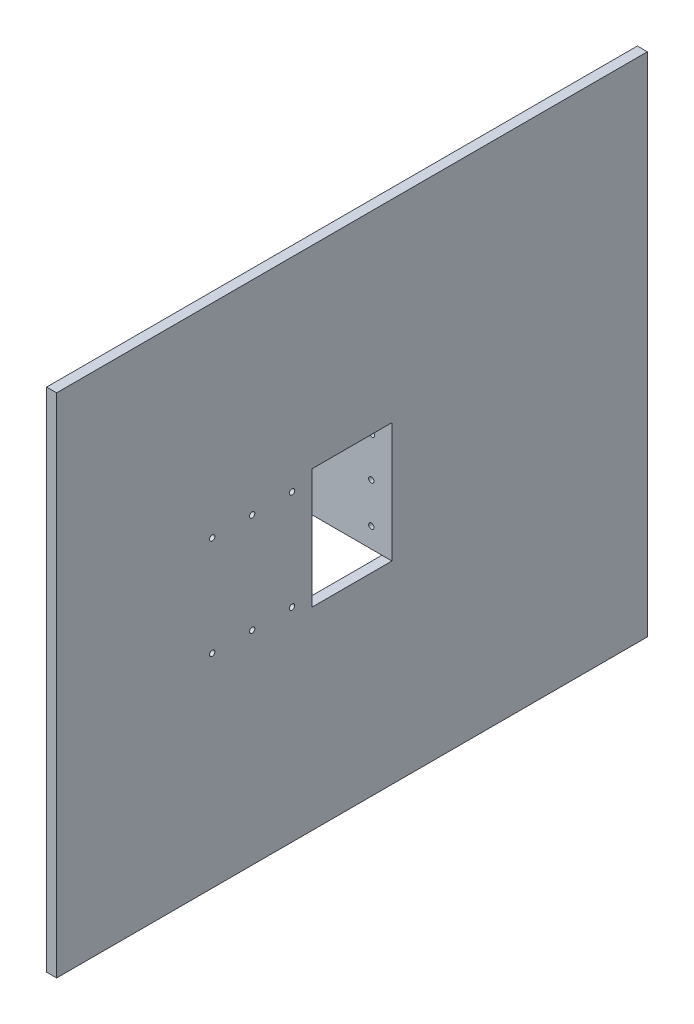
ISO-10303-21;
HEADER;
FILE_DESCRIPTION(('STEP AP214'),'2;1');
FILE_NAME('part.step','',(''),(''),'','','');
FILE_SCHEMA(('AUTOMOTIVE_DESIGN { 1 0 10303 214 1 1 1 1 }'));
ENDSEC;
DATA;
#1=APPLICATION_CONTEXT('core data for automotive mechanical design processes');
#2=APPLICATION_PROTOCOL_DEFINITION('international standard','automotive_design',2000,#1);
#3=PRODUCT_CONTEXT('',#1,'mechanical');
#4=PRODUCT('Part','Part','',(#3));
#5=PRODUCT_RELATED_PRODUCT_CATEGORY('part','',(#4));
#6=PRODUCT_DEFINITION_FORMATION('','',#4);
#7=PRODUCT_DEFINITION_CONTEXT('part definition',#1,'design');
#8=PRODUCT_DEFINITION('design','',#6,#7);
#9=PRODUCT_DEFINITION_SHAPE('','',#8);
#10=(LENGTH_UNIT() NAMED_UNIT(*) SI_UNIT(.MILLI.,.METRE.));
#11=(NAMED_UNIT(*) PLANE_ANGLE_UNIT() SI_UNIT($,.RADIAN.));
#12=(NAMED_UNIT(*) SI_UNIT($,.STERADIAN.) SOLID_ANGLE_UNIT());
#13=UNCERTAINTY_MEASURE_WITH_UNIT(LENGTH_MEASURE(1.E-05),#10,'distance_accuracy_value','');
#14=(GEOMETRIC_REPRESENTATION_CONTEXT(3) GLOBAL_UNCERTAINTY_ASSIGNED_CONTEXT((#13)) GLOBAL_UNIT_ASSIGNED_CONTEXT((#10,
#11,#12)) REPRESENTATION_CONTEXT('',''));
#15=CARTESIAN_POINT('',(0.,0.,0.));
#16=DIRECTION('',(0.,0.,1.));
#17=DIRECTION('',(1.,0.,0.));
#18=AXIS2_PLACEMENT_3D('',#15,#16,#17);
#19=CARTESIAN_POINT('',(0.,0.,15.));
#20=DIRECTION('',(0.,0.,-1.));
#21=DIRECTION('',(-1.,0.,0.));
#22=AXIS2_PLACEMENT_3D('',#19,#20,#21);
#23=PLANE('',#22);
#24=CARTESIAN_POINT('',(74.0356255045645,0.,15.));
#25=DIRECTION('',(0.,0.,1.));
#26=DIRECTION('',(-1.,0.,0.));
#27=AXIS2_PLACEMENT_3D('',#24,#25,#26);
#28=CIRCLE('',#27,4.00000000000001);
#29=CARTESIAN_POINT('',(70.0356255045645,0.,15.));
#30=VERTEX_POINT('',#29);
#31=EDGE_CURVE('E204',#30,#30,#28,.T.);
#32=ORIENTED_EDGE('',*,*,#31,.F.);
#33=EDGE_LOOP('',(#32));
#34=FACE_BOUND('',#33,.T.);
#35=CARTESIAN_POINT('',(-74.0356255045645,-60.,15.));
#36=DIRECTION('',(0.,0.,1.));
#37=DIRECTION('',(1.,0.,0.));
#38=AXIS2_PLACEMENT_3D('',#35,#36,#37);
#39=CIRCLE('',#38,4.00000000000001);
#40=CARTESIAN_POINT('',(-70.0356255045645,-60.,15.));
#41=VERTEX_POINT('',#40);
#42=EDGE_CURVE('E216',#41,#41,#39,.T.);
#43=ORIENTED_EDGE('',*,*,#42,.F.);
#44=EDGE_LOOP('',(#43));
#45=FACE_BOUND('',#44,.T.);
#46=CARTESIAN_POINT('',(-75.,60.,15.));
#47=DIRECTION('',(0.,0.,1.));
#48=DIRECTION('',(1.,0.,0.));
#49=AXIS2_PLACEMENT_3D('',#46,#47,#48);
#50=CIRCLE('',#49,4.00000000000001);
#51=CARTESIAN_POINT('',(-71.,60.,15.));
#52=VERTEX_POINT('',#51);
#53=EDGE_CURVE('E228',#52,#52,#50,.T.);
#54=ORIENTED_EDGE('',*,*,#53,.F.);
#55=EDGE_LOOP('',(#54));
#56=FACE_BOUND('',#55,.T.);
#57=DIRECTION('',(1.,0.,0.));
#58=VECTOR('',#57,1.);
#59=CARTESIAN_POINT('',(-90.,-90.,15.));
#60=LINE('',#59,#58);
#61=CARTESIAN_POINT('',(-90.,-90.,15.));
#62=VERTEX_POINT('',#61);
#63=CARTESIAN_POINT('',(90.,-90.,15.));
#64=VERTEX_POINT('',#63);
#65=EDGE_CURVE('E52',#62,#64,#60,.T.);
#66=ORIENTED_EDGE('',*,*,#65,.T.);
#67=DIRECTION('',(-1.,0.,0.));
#68=VECTOR('',#67,1.);
#69=CARTESIAN_POINT('',(105.,-90.,15.));
#70=LINE('',#69,#68);
#71=CARTESIAN_POINT('',(105.,-90.,15.));
#72=VERTEX_POINT('',#71);
#73=EDGE_CURVE('E130',#72,#64,#70,.T.);
#74=ORIENTED_EDGE('',*,*,#73,.F.);
#75=DIRECTION('',(0.,1.,0.));
#76=VECTOR('',#75,1.);
#77=CARTESIAN_POINT('',(105.,-90.,15.));
#78=LINE('',#77,#76);
#79=CARTESIAN_POINT('',(105.,90.,15.));
#80=VERTEX_POINT('',#79);
#81=EDGE_CURVE('E125',#72,#80,#78,.T.);
#82=ORIENTED_EDGE('',*,*,#81,.T.);
#83=DIRECTION('',(-1.,0.,0.));
#84=VECTOR('',#83,1.);
#85=CARTESIAN_POINT('',(105.,90.,15.));
#86=LINE('',#85,#84);
#87=CARTESIAN_POINT('',(90.,90.,15.));
#88=VERTEX_POINT('',#87);
#89=EDGE_CURVE('E128',#80,#88,#86,.T.);
#90=ORIENTED_EDGE('',*,*,#89,.T.);
#91=DIRECTION('',(-1.,0.,0.));
#92=VECTOR('',#91,1.);
#93=CARTESIAN_POINT('',(-90.,90.,15.));
#94=LINE('',#93,#92);
#95=CARTESIAN_POINT('',(-90.,90.,15.));
#96=VERTEX_POINT('',#95);
#97=EDGE_CURVE('E77',#88,#96,#94,.T.);
#98=ORIENTED_EDGE('',*,*,#97,.T.);
#99=DIRECTION('',(0.,-1.,0.));
#100=VECTOR('',#99,1.);
#101=CARTESIAN_POINT('',(-90.,-90.,15.));
#102=LINE('',#101,#100);
#103=EDGE_CURVE('E235',#96,#62,#102,.T.);
#104=ORIENTED_EDGE('',*,*,#103,.T.);
#105=EDGE_LOOP('',(#66,#74,#82,#90,#98,#104));
#106=FACE_BOUND('',#105,.T.);
#107=CARTESIAN_POINT('',(-74.0356255045645,0.,15.));
#108=DIRECTION('',(0.,0.,1.));
#109=DIRECTION('',(1.,0.,0.));
#110=AXIS2_PLACEMENT_3D('',#107,#108,#109);
#111=CIRCLE('',#110,4.00000000000001);
#112=CARTESIAN_POINT('',(-70.0356255045645,0.,15.));
#113=VERTEX_POINT('',#112);
#114=EDGE_CURVE('E222',#113,#113,#111,.T.);
#115=ORIENTED_EDGE('',*,*,#114,.F.);
#116=EDGE_LOOP('',(#115));
#117=FACE_BOUND('',#116,.T.);
#118=CARTESIAN_POINT('',(74.0356255045645,-60.,15.));
#119=DIRECTION('',(0.,0.,1.));
#120=DIRECTION('',(-1.,0.,0.));
#121=AXIS2_PLACEMENT_3D('',#118,#119,#120);
#122=CIRCLE('',#121,4.00000000000001);
#123=CARTESIAN_POINT('',(70.0356255045645,-60.,15.));
#124=VERTEX_POINT('',#123);
#125=EDGE_CURVE('E210',#124,#124,#122,.T.);
#126=ORIENTED_EDGE('',*,*,#125,.F.);
#127=EDGE_LOOP('',(#126));
#128=FACE_BOUND('',#127,.T.);
#129=CARTESIAN_POINT('',(75.,60.,15.));
#130=DIRECTION('',(0.,0.,1.));
#131=DIRECTION('',(-1.,0.,0.));
#132=AXIS2_PLACEMENT_3D('',#129,#130,#131);
#133=CIRCLE('',#132,4.00000000000001);
#134=CARTESIAN_POINT('',(71.,60.,15.));
#135=VERTEX_POINT('',#134);
#136=EDGE_CURVE('E198',#135,#135,#133,.T.);
#137=ORIENTED_EDGE('',*,*,#136,.F.);
#138=EDGE_LOOP('',(#137));
#139=FACE_BOUND('',#138,.T.);
#140=ADVANCED_FACE('F35',(#34,#45,#56,#106,#117,#128,#139),#23,.F.);
#141=CARTESIAN_POINT('',(0.,0.,0.));
#142=DIRECTION('',(0.,0.,-1.));
#143=DIRECTION('',(-1.,0.,0.));
#144=AXIS2_PLACEMENT_3D('',#141,#142,#143);
#145=PLANE('',#144);
#146=CARTESIAN_POINT('',(74.0356255045645,0.,0.));
#147=DIRECTION('',(0.,0.,1.));
#148=DIRECTION('',(-1.,0.,0.));
#149=AXIS2_PLACEMENT_3D('',#146,#147,#148);
#150=CIRCLE('',#149,4.00000000000001);
#151=CARTESIAN_POINT('',(70.0356255045645,0.,0.));
#152=VERTEX_POINT('',#151);
#153=EDGE_CURVE('E201',#152,#152,#150,.T.);
#154=ORIENTED_EDGE('',*,*,#153,.T.);
#155=EDGE_LOOP('',(#154));
#156=FACE_BOUND('',#155,.T.);
#157=CARTESIAN_POINT('',(-74.0356255045645,-60.,0.));
#158=DIRECTION('',(0.,0.,1.));
#159=DIRECTION('',(1.,0.,0.));
#160=AXIS2_PLACEMENT_3D('',#157,#158,#159);
#161=CIRCLE('',#160,4.00000000000001);
#162=CARTESIAN_POINT('',(-70.0356255045645,-60.,0.));
#163=VERTEX_POINT('',#162);
#164=EDGE_CURVE('E213',#163,#163,#161,.T.);
#165=ORIENTED_EDGE('',*,*,#164,.T.);
#166=EDGE_LOOP('',(#165));
#167=FACE_BOUND('',#166,.T.);
#168=CARTESIAN_POINT('',(-75.,60.,0.));
#169=DIRECTION('',(0.,0.,1.));
#170=DIRECTION('',(1.,0.,0.));
#171=AXIS2_PLACEMENT_3D('',#168,#169,#170);
#172=CIRCLE('',#171,4.00000000000001);
#173=CARTESIAN_POINT('',(-71.,60.,0.));
#174=VERTEX_POINT('',#173);
#175=EDGE_CURVE('E225',#174,#174,#172,.T.);
#176=ORIENTED_EDGE('',*,*,#175,.T.);
#177=EDGE_LOOP('',(#176));
#178=FACE_BOUND('',#177,.T.);
#179=DIRECTION('',(0.,1.,0.));
#180=VECTOR('',#179,1.);
#181=CARTESIAN_POINT('',(90.,-90.,0.));
#182=LINE('',#181,#180);
#183=CARTESIAN_POINT('',(90.,-90.,0.));
#184=VERTEX_POINT('',#183);
#185=CARTESIAN_POINT('',(90.,90.,0.));
#186=VERTEX_POINT('',#185);
#187=EDGE_CURVE('E231',#184,#186,#182,.T.);
#188=ORIENTED_EDGE('',*,*,#187,.F.);
#189=DIRECTION('',(1.,0.,0.));
#190=VECTOR('',#189,1.);
#191=CARTESIAN_POINT('',(-90.,-90.,0.));
#192=LINE('',#191,#190);
#193=CARTESIAN_POINT('',(-90.,-90.,0.));
#194=VERTEX_POINT('',#193);
#195=EDGE_CURVE('E236',#194,#184,#192,.T.);
#196=ORIENTED_EDGE('',*,*,#195,.F.);
#197=DIRECTION('',(0.,-1.,0.));
#198=VECTOR('',#197,1.);
#199=CARTESIAN_POINT('',(-90.,-90.,0.));
#200=LINE('',#199,#198);
#201=CARTESIAN_POINT('',(-90.,90.,0.));
#202=VERTEX_POINT('',#201);
#203=EDGE_CURVE('E72',#202,#194,#200,.T.);
#204=ORIENTED_EDGE('',*,*,#203,.F.);
#205=DIRECTION('',(-1.,0.,0.));
#206=VECTOR('',#205,1.);
#207=CARTESIAN_POINT('',(-90.,90.,0.));
#208=LINE('',#207,#206);
#209=EDGE_CURVE('E65',#186,#202,#208,.T.);
#210=ORIENTED_EDGE('',*,*,#209,.F.);
#211=EDGE_LOOP('',(#188,#196,#204,#210));
#212=FACE_BOUND('',#211,.T.);
#213=CARTESIAN_POINT('',(-74.0356255045645,0.,0.));
#214=DIRECTION('',(0.,0.,1.));
#215=DIRECTION('',(1.,0.,0.));
#216=AXIS2_PLACEMENT_3D('',#213,#214,#215);
#217=CIRCLE('',#216,4.00000000000001);
#218=CARTESIAN_POINT('',(-70.0356255045645,0.,0.));
#219=VERTEX_POINT('',#218);
#220=EDGE_CURVE('E219',#219,#219,#217,.T.);
#221=ORIENTED_EDGE('',*,*,#220,.T.);
#222=EDGE_LOOP('',(#221));
#223=FACE_BOUND('',#222,.T.);
#224=CARTESIAN_POINT('',(74.0356255045645,-60.,0.));
#225=DIRECTION('',(0.,0.,1.));
#226=DIRECTION('',(-1.,0.,0.));
#227=AXIS2_PLACEMENT_3D('',#224,#225,#226);
#228=CIRCLE('',#227,4.00000000000001);
#229=CARTESIAN_POINT('',(70.0356255045645,-60.,0.));
#230=VERTEX_POINT('',#229);
#231=EDGE_CURVE('E207',#230,#230,#228,.T.);
#232=ORIENTED_EDGE('',*,*,#231,.T.);
#233=EDGE_LOOP('',(#232));
#234=FACE_BOUND('',#233,.T.);
#235=CARTESIAN_POINT('',(75.,60.,0.));
#236=DIRECTION('',(0.,0.,1.));
#237=DIRECTION('',(-1.,0.,0.));
#238=AXIS2_PLACEMENT_3D('',#235,#236,#237);
#239=CIRCLE('',#238,4.00000000000001);
#240=CARTESIAN_POINT('',(71.,60.,0.));
#241=VERTEX_POINT('',#240);
#242=EDGE_CURVE('E197',#241,#241,#239,.T.);
#243=ORIENTED_EDGE('',*,*,#242,.T.);
#244=EDGE_LOOP('',(#243));
#245=FACE_BOUND('',#244,.T.);
#246=ADVANCED_FACE('F253',(#156,#167,#178,#212,#223,#234,#245),#145,.T.);
#247=CARTESIAN_POINT('',(-90.,90.,15.));
#248=DIRECTION('',(0.,-1.,0.));
#249=DIRECTION('',(0.,0.,-1.));
#250=AXIS2_PLACEMENT_3D('',#247,#248,#249);
#251=PLANE('',#250);
#252=ORIENTED_EDGE('',*,*,#209,.T.);
#253=DIRECTION('',(0.,0.,-1.));
#254=VECTOR('',#253,1.);
#255=CARTESIAN_POINT('',(-90.,90.,15.));
#256=LINE('',#255,#254);
#257=EDGE_CURVE('E44',#96,#202,#256,.T.);
#258=ORIENTED_EDGE('',*,*,#257,.F.);
#259=ORIENTED_EDGE('',*,*,#97,.F.);
#260=DIRECTION('',(0.,0.,-1.));
#261=VECTOR('',#260,1.);
#262=CARTESIAN_POINT('',(90.,90.,15.));
#263=LINE('',#262,#261);
#264=EDGE_CURVE('E11',#88,#186,#263,.T.);
#265=ORIENTED_EDGE('',*,*,#264,.T.);
#266=EDGE_LOOP('',(#252,#258,#259,#265));
#267=FACE_BOUND('',#266,.T.);
#268=ADVANCED_FACE('F37',(#267),#251,.F.);
#269=CARTESIAN_POINT('',(-90.,-90.,15.));
#270=DIRECTION('',(1.,0.,0.));
#271=DIRECTION('',(0.,0.,-1.));
#272=AXIS2_PLACEMENT_3D('',#269,#270,#271);
#273=PLANE('',#272);
#274=ORIENTED_EDGE('',*,*,#203,.T.);
#275=DIRECTION('',(0.,0.,-1.));
#276=VECTOR('',#275,1.);
#277=CARTESIAN_POINT('',(-90.,-90.,15.));
#278=LINE('',#277,#276);
#279=EDGE_CURVE('E248',#62,#194,#278,.T.);
#280=ORIENTED_EDGE('',*,*,#279,.F.);
#281=ORIENTED_EDGE('',*,*,#103,.F.);
#282=ORIENTED_EDGE('',*,*,#257,.T.);
#283=EDGE_LOOP('',(#274,#280,#281,#282));
#284=FACE_BOUND('',#283,.T.);
#285=ADVANCED_FACE('F250',(#284),#273,.F.);
#286=CARTESIAN_POINT('',(-90.,-90.,15.));
#287=DIRECTION('',(0.,1.,0.));
#288=DIRECTION('',(0.,0.,1.));
#289=AXIS2_PLACEMENT_3D('',#286,#287,#288);
#290=PLANE('',#289);
#291=ORIENTED_EDGE('',*,*,#195,.T.);
#292=DIRECTION('',(0.,0.,-1.));
#293=VECTOR('',#292,1.);
#294=CARTESIAN_POINT('',(90.,-90.,15.));
#295=LINE('',#294,#293);
#296=EDGE_CURVE('E239',#64,#184,#295,.T.);
#297=ORIENTED_EDGE('',*,*,#296,.F.);
#298=ORIENTED_EDGE('',*,*,#65,.F.);
#299=ORIENTED_EDGE('',*,*,#279,.T.);
#300=EDGE_LOOP('',(#291,#297,#298,#299));
#301=FACE_BOUND('',#300,.T.);
#302=ADVANCED_FACE('F256',(#301),#290,.F.);
#303=CARTESIAN_POINT('',(-75.,60.,15.));
#304=DIRECTION('',(0.,0.,-1.));
#305=DIRECTION('',(-1.,0.,0.));
#306=AXIS2_PLACEMENT_3D('',#303,#304,#305);
#307=CYLINDRICAL_SURFACE('',#306,4.00000000000001);
#308=ORIENTED_EDGE('',*,*,#53,.T.);
#309=EDGE_LOOP('',(#308));
#310=FACE_BOUND('',#309,.T.);
#311=ORIENTED_EDGE('',*,*,#175,.F.);
#312=EDGE_LOOP('',(#311));
#313=FACE_BOUND('',#312,.T.);
#314=ADVANCED_FACE('F280',(#310,#313),#307,.F.);
#315=CARTESIAN_POINT('',(-74.0356255045645,0.,15.));
#316=DIRECTION('',(0.,0.,-1.));
#317=DIRECTION('',(-1.,0.,0.));
#318=AXIS2_PLACEMENT_3D('',#315,#316,#317);
#319=CYLINDRICAL_SURFACE('',#318,4.00000000000001);
#320=ORIENTED_EDGE('',*,*,#114,.T.);
#321=EDGE_LOOP('',(#320));
#322=FACE_BOUND('',#321,.T.);
#323=ORIENTED_EDGE('',*,*,#220,.F.);
#324=EDGE_LOOP('',(#323));
#325=FACE_BOUND('',#324,.T.);
#326=ADVANCED_FACE('F287',(#322,#325),#319,.F.);
#327=CARTESIAN_POINT('',(-74.0356255045645,-60.,15.));
#328=DIRECTION('',(0.,0.,-1.));
#329=DIRECTION('',(-1.,0.,0.));
#330=AXIS2_PLACEMENT_3D('',#327,#328,#329);
#331=CYLINDRICAL_SURFACE('',#330,4.00000000000001);
#332=ORIENTED_EDGE('',*,*,#42,.T.);
#333=EDGE_LOOP('',(#332));
#334=FACE_BOUND('',#333,.T.);
#335=ORIENTED_EDGE('',*,*,#164,.F.);
#336=EDGE_LOOP('',(#335));
#337=FACE_BOUND('',#336,.T.);
#338=ADVANCED_FACE('F292',(#334,#337),#331,.F.);
#339=CARTESIAN_POINT('',(74.0356255045645,-60.,15.));
#340=DIRECTION('',(0.,0.,-1.));
#341=DIRECTION('',(-1.,0.,0.));
#342=AXIS2_PLACEMENT_3D('',#339,#340,#341);
#343=CYLINDRICAL_SURFACE('',#342,4.00000000000001);
#344=ORIENTED_EDGE('',*,*,#125,.T.);
#345=EDGE_LOOP('',(#344));
#346=FACE_BOUND('',#345,.T.);
#347=ORIENTED_EDGE('',*,*,#231,.F.);
#348=EDGE_LOOP('',(#347));
#349=FACE_BOUND('',#348,.T.);
#350=ADVANCED_FACE('F302',(#346,#349),#343,.F.);
#351=CARTESIAN_POINT('',(74.0356255045645,0.,15.));
#352=DIRECTION('',(0.,0.,-1.));
#353=DIRECTION('',(-1.,0.,0.));
#354=AXIS2_PLACEMENT_3D('',#351,#352,#353);
#355=CYLINDRICAL_SURFACE('',#354,4.00000000000001);
#356=ORIENTED_EDGE('',*,*,#31,.T.);
#357=EDGE_LOOP('',(#356));
#358=FACE_BOUND('',#357,.T.);
#359=ORIENTED_EDGE('',*,*,#153,.F.);
#360=EDGE_LOOP('',(#359));
#361=FACE_BOUND('',#360,.T.);
#362=ADVANCED_FACE('F309',(#358,#361),#355,.F.);
#363=CARTESIAN_POINT('',(75.,60.,15.));
#364=DIRECTION('',(0.,0.,-1.));
#365=DIRECTION('',(-1.,0.,0.));
#366=AXIS2_PLACEMENT_3D('',#363,#364,#365);
#367=CYLINDRICAL_SURFACE('',#366,4.00000000000001);
#368=ORIENTED_EDGE('',*,*,#136,.T.);
#369=EDGE_LOOP('',(#368));
#370=FACE_BOUND('',#369,.T.);
#371=ORIENTED_EDGE('',*,*,#242,.F.);
#372=EDGE_LOOP('',(#371));
#373=FACE_BOUND('',#372,.T.);
#374=ADVANCED_FACE('F313',(#370,#373),#367,.F.);
#375=CARTESIAN_POINT('',(90.,0.,0.));
#376=DIRECTION('',(-1.,0.,0.));
#377=DIRECTION('',(0.,0.,1.));
#378=AXIS2_PLACEMENT_3D('',#375,#376,#377);
#379=PLANE('',#378);
#380=CARTESIAN_POINT('',(90.,-75.,165.));
#381=DIRECTION('',(1.,0.,0.));
#382=DIRECTION('',(0.,0.,1.));
#383=AXIS2_PLACEMENT_3D('',#380,#381,#382);
#384=CIRCLE('',#383,3.99999999999999);
#385=CARTESIAN_POINT('',(90.,-75.,169.));
#386=VERTEX_POINT('',#385);
#387=EDGE_CURVE('E377',#386,#386,#384,.T.);
#388=ORIENTED_EDGE('',*,*,#387,.T.);
#389=EDGE_LOOP('',(#388));
#390=FACE_BOUND('',#389,.T.);
#391=CARTESIAN_POINT('',(90.,75.,285.));
#392=DIRECTION('',(1.,0.,0.));
#393=DIRECTION('',(0.,0.,-1.));
#394=AXIS2_PLACEMENT_3D('',#391,#392,#393);
#395=CIRCLE('',#394,3.99999999999999);
#396=CARTESIAN_POINT('',(90.,75.,281.));
#397=VERTEX_POINT('',#396);
#398=EDGE_CURVE('E385',#397,#397,#395,.T.);
#399=ORIENTED_EDGE('',*,*,#398,.T.);
#400=EDGE_LOOP('',(#399));
#401=FACE_BOUND('',#400,.T.);
#402=CARTESIAN_POINT('',(90.,75.,225.));
#403=DIRECTION('',(1.,0.,0.));
#404=DIRECTION('',(0.,0.,-1.));
#405=AXIS2_PLACEMENT_3D('',#402,#403,#404);
#406=CIRCLE('',#405,3.99999999999999);
#407=CARTESIAN_POINT('',(90.,75.,221.));
#408=VERTEX_POINT('',#407);
#409=EDGE_CURVE('E397',#408,#408,#406,.T.);
#410=ORIENTED_EDGE('',*,*,#409,.T.);
#411=EDGE_LOOP('',(#410));
#412=FACE_BOUND('',#411,.T.);
#413=DIRECTION('',(0.,1.,0.));
#414=VECTOR('',#413,1.);
#415=CARTESIAN_POINT('',(90.,-380.716091082517,-368.779119663687));
#416=LINE('',#415,#414);
#417=CARTESIAN_POINT('',(90.,-380.716091082517,-368.779119663687));
#418=VERTEX_POINT('',#417);
#419=CARTESIAN_POINT('',(90.,380.716091082517,-368.779119663687));
#420=VERTEX_POINT('',#419);
#421=EDGE_CURVE('E143',#418,#420,#416,.T.);
#422=ORIENTED_EDGE('',*,*,#421,.F.);
#423=DIRECTION('',(0.,0.,-1.));
#424=VECTOR('',#423,1.);
#425=CARTESIAN_POINT('',(90.,-380.716091082517,518.779119663687));
#426=LINE('',#425,#424);
#427=CARTESIAN_POINT('',(90.,-380.716091082517,518.779119663687));
#428=VERTEX_POINT('',#427);
#429=EDGE_CURVE('E172',#428,#418,#426,.T.);
#430=ORIENTED_EDGE('',*,*,#429,.F.);
#431=DIRECTION('',(0.,-1.,0.));
#432=VECTOR('',#431,1.);
#433=CARTESIAN_POINT('',(90.,-380.716091082517,518.779119663687));
#434=LINE('',#433,#432);
#435=CARTESIAN_POINT('',(90.,380.716091082517,518.779119663687));
#436=VERTEX_POINT('',#435);
#437=EDGE_CURVE('E183',#436,#428,#434,.T.);
#438=ORIENTED_EDGE('',*,*,#437,.F.);
#439=DIRECTION('',(0.,0.,1.));
#440=VECTOR('',#439,1.);
#441=CARTESIAN_POINT('',(90.,380.716091082517,518.779119663687));
#442=LINE('',#441,#440);
#443=EDGE_CURVE('E181',#420,#436,#442,.T.);
#444=ORIENTED_EDGE('',*,*,#443,.F.);
#445=EDGE_LOOP('',(#422,#430,#438,#444));
#446=FACE_BOUND('',#445,.T.);
#447=CARTESIAN_POINT('',(90.,75.,165.));
#448=DIRECTION('',(1.,0.,0.));
#449=DIRECTION('',(0.,0.,-1.));
#450=AXIS2_PLACEMENT_3D('',#447,#448,#449);
#451=CIRCLE('',#450,3.99999999999999);
#452=CARTESIAN_POINT('',(90.,75.,161.));
#453=VERTEX_POINT('',#452);
#454=EDGE_CURVE('E403',#453,#453,#451,.T.);
#455=ORIENTED_EDGE('',*,*,#454,.T.);
#456=EDGE_LOOP('',(#455));
#457=FACE_BOUND('',#456,.T.);
#458=CARTESIAN_POINT('',(90.,-75.,285.));
#459=DIRECTION('',(1.,0.,0.));
#460=DIRECTION('',(0.,0.,1.));
#461=AXIS2_PLACEMENT_3D('',#458,#459,#460);
#462=CIRCLE('',#461,3.99999999999999);
#463=CARTESIAN_POINT('',(90.,-75.,289.));
#464=VERTEX_POINT('',#463);
#465=EDGE_CURVE('E391',#464,#464,#462,.T.);
#466=ORIENTED_EDGE('',*,*,#465,.T.);
#467=EDGE_LOOP('',(#466));
#468=FACE_BOUND('',#467,.T.);
#469=CARTESIAN_POINT('',(90.,-75.,225.));
#470=DIRECTION('',(1.,0.,0.));
#471=DIRECTION('',(0.,0.,1.));
#472=AXIS2_PLACEMENT_3D('',#469,#470,#471);
#473=CIRCLE('',#472,3.99999999999999);
#474=CARTESIAN_POINT('',(90.,-75.,229.));
#475=VERTEX_POINT('',#474);
#476=EDGE_CURVE('E379',#475,#475,#473,.T.);
#477=ORIENTED_EDGE('',*,*,#476,.T.);
#478=EDGE_LOOP('',(#477));
#479=FACE_BOUND('',#478,.T.);
#480=ORIENTED_EDGE('',*,*,#264,.F.);
#481=DIRECTION('',(0.,0.,1.));
#482=VECTOR('',#481,1.);
#483=CARTESIAN_POINT('',(90.,90.,135.));
#484=LINE('',#483,#482);
#485=CARTESIAN_POINT('',(90.,90.,135.));
#486=VERTEX_POINT('',#485);
#487=EDGE_CURVE('E142',#88,#486,#484,.T.);
#488=ORIENTED_EDGE('',*,*,#487,.T.);
#489=DIRECTION('',(0.,-1.,0.));
#490=VECTOR('',#489,1.);
#491=CARTESIAN_POINT('',(90.,-90.,135.));
#492=LINE('',#491,#490);
#493=CARTESIAN_POINT('',(90.,-90.,135.));
#494=VERTEX_POINT('',#493);
#495=EDGE_CURVE('E158',#486,#494,#492,.T.);
#496=ORIENTED_EDGE('',*,*,#495,.T.);
#497=DIRECTION('',(0.,0.,-1.));
#498=VECTOR('',#497,1.);
#499=CARTESIAN_POINT('',(90.,-90.,135.));
#500=LINE('',#499,#498);
#501=EDGE_CURVE('E135',#494,#64,#500,.T.);
#502=ORIENTED_EDGE('',*,*,#501,.T.);
#503=ORIENTED_EDGE('',*,*,#296,.T.);
#504=ORIENTED_EDGE('',*,*,#187,.T.);
#505=EDGE_LOOP('',(#480,#488,#496,#502,#503,#504));
#506=FACE_BOUND('',#505,.T.);
#507=ADVANCED_FACE('F258',(#390,#401,#412,#446,#457,#468,#479,#506),#379,.T.);
#508=CARTESIAN_POINT('',(105.,0.,0.));
#509=DIRECTION('',(-1.,0.,0.));
#510=DIRECTION('',(0.,0.,1.));
#511=AXIS2_PLACEMENT_3D('',#508,#509,#510);
#512=PLANE('',#511);
#513=CARTESIAN_POINT('',(105.,-75.,225.));
#514=DIRECTION('',(1.,0.,0.));
#515=DIRECTION('',(0.,0.,1.));
#516=AXIS2_PLACEMENT_3D('',#513,#514,#515);
#517=CIRCLE('',#516,3.99999999999999);
#518=CARTESIAN_POINT('',(105.,-75.,229.));
#519=VERTEX_POINT('',#518);
#520=EDGE_CURVE('E382',#519,#519,#517,.T.);
#521=ORIENTED_EDGE('',*,*,#520,.F.);
#522=EDGE_LOOP('',(#521));
#523=FACE_BOUND('',#522,.T.);
#524=CARTESIAN_POINT('',(105.,-75.,285.));
#525=DIRECTION('',(1.,0.,0.));
#526=DIRECTION('',(0.,0.,1.));
#527=AXIS2_PLACEMENT_3D('',#524,#525,#526);
#528=CIRCLE('',#527,3.99999999999999);
#529=CARTESIAN_POINT('',(105.,-75.,289.));
#530=VERTEX_POINT('',#529);
#531=EDGE_CURVE('E394',#530,#530,#528,.T.);
#532=ORIENTED_EDGE('',*,*,#531,.F.);
#533=EDGE_LOOP('',(#532));
#534=FACE_BOUND('',#533,.T.);
#535=CARTESIAN_POINT('',(105.,75.,165.));
#536=DIRECTION('',(1.,0.,0.));
#537=DIRECTION('',(0.,0.,-1.));
#538=AXIS2_PLACEMENT_3D('',#535,#536,#537);
#539=CIRCLE('',#538,3.99999999999999);
#540=CARTESIAN_POINT('',(105.,75.,161.));
#541=VERTEX_POINT('',#540);
#542=EDGE_CURVE('E159',#541,#541,#539,.T.);
#543=ORIENTED_EDGE('',*,*,#542,.F.);
#544=EDGE_LOOP('',(#543));
#545=FACE_BOUND('',#544,.T.);
#546=DIRECTION('',(0.,1.,0.));
#547=VECTOR('',#546,1.);
#548=CARTESIAN_POINT('',(105.,-380.716091082517,-368.779119663687));
#549=LINE('',#548,#547);
#550=CARTESIAN_POINT('',(105.,-380.716091082517,-368.779119663687));
#551=VERTEX_POINT('',#550);
#552=CARTESIAN_POINT('',(105.,380.716091082517,-368.779119663687));
#553=VERTEX_POINT('',#552);
#554=EDGE_CURVE('E168',#551,#553,#549,.T.);
#555=ORIENTED_EDGE('',*,*,#554,.T.);
#556=DIRECTION('',(0.,0.,1.));
#557=VECTOR('',#556,1.);
#558=CARTESIAN_POINT('',(105.,380.716091082517,518.779119663687));
#559=LINE('',#558,#557);
#560=CARTESIAN_POINT('',(105.,380.716091082517,518.779119663687));
#561=VERTEX_POINT('',#560);
#562=EDGE_CURVE('E171',#553,#561,#559,.T.);
#563=ORIENTED_EDGE('',*,*,#562,.T.);
#564=DIRECTION('',(0.,-1.,0.));
#565=VECTOR('',#564,1.);
#566=CARTESIAN_POINT('',(105.,-380.716091082517,518.779119663687));
#567=LINE('',#566,#565);
#568=CARTESIAN_POINT('',(105.,-380.716091082517,518.779119663687));
#569=VERTEX_POINT('',#568);
#570=EDGE_CURVE('E174',#561,#569,#567,.T.);
#571=ORIENTED_EDGE('',*,*,#570,.T.);
#572=DIRECTION('',(0.,0.,-1.));
#573=VECTOR('',#572,1.);
#574=CARTESIAN_POINT('',(105.,-380.716091082517,518.779119663687));
#575=LINE('',#574,#573);
#576=EDGE_CURVE('E176',#569,#551,#575,.T.);
#577=ORIENTED_EDGE('',*,*,#576,.T.);
#578=EDGE_LOOP('',(#555,#563,#571,#577));
#579=FACE_BOUND('',#578,.T.);
#580=ORIENTED_EDGE('',*,*,#81,.F.);
#581=DIRECTION('',(0.,0.,-1.));
#582=VECTOR('',#581,1.);
#583=CARTESIAN_POINT('',(105.,-90.,135.));
#584=LINE('',#583,#582);
#585=CARTESIAN_POINT('',(105.,-90.,135.));
#586=VERTEX_POINT('',#585);
#587=EDGE_CURVE('E152',#586,#72,#584,.T.);
#588=ORIENTED_EDGE('',*,*,#587,.F.);
#589=DIRECTION('',(0.,-1.,0.));
#590=VECTOR('',#589,1.);
#591=CARTESIAN_POINT('',(105.,-90.,135.));
#592=LINE('',#591,#590);
#593=CARTESIAN_POINT('',(105.,90.,135.));
#594=VERTEX_POINT('',#593);
#595=EDGE_CURVE('E150',#594,#586,#592,.T.);
#596=ORIENTED_EDGE('',*,*,#595,.F.);
#597=DIRECTION('',(0.,0.,1.));
#598=VECTOR('',#597,1.);
#599=CARTESIAN_POINT('',(105.,90.,135.));
#600=LINE('',#599,#598);
#601=EDGE_CURVE('E134',#80,#594,#600,.T.);
#602=ORIENTED_EDGE('',*,*,#601,.F.);
#603=EDGE_LOOP('',(#580,#588,#596,#602));
#604=FACE_BOUND('',#603,.T.);
#605=CARTESIAN_POINT('',(105.,75.,225.));
#606=DIRECTION('',(1.,0.,0.));
#607=DIRECTION('',(0.,0.,-1.));
#608=AXIS2_PLACEMENT_3D('',#605,#606,#607);
#609=CIRCLE('',#608,3.99999999999999);
#610=CARTESIAN_POINT('',(105.,75.,221.));
#611=VERTEX_POINT('',#610);
#612=EDGE_CURVE('E400',#611,#611,#609,.T.);
#613=ORIENTED_EDGE('',*,*,#612,.F.);
#614=EDGE_LOOP('',(#613));
#615=FACE_BOUND('',#614,.T.);
#616=CARTESIAN_POINT('',(105.,75.,285.));
#617=DIRECTION('',(1.,0.,0.));
#618=DIRECTION('',(0.,0.,-1.));
#619=AXIS2_PLACEMENT_3D('',#616,#617,#618);
#620=CIRCLE('',#619,3.99999999999999);
#621=CARTESIAN_POINT('',(105.,75.,281.));
#622=VERTEX_POINT('',#621);
#623=EDGE_CURVE('E388',#622,#622,#620,.T.);
#624=ORIENTED_EDGE('',*,*,#623,.F.);
#625=EDGE_LOOP('',(#624));
#626=FACE_BOUND('',#625,.T.);
#627=CARTESIAN_POINT('',(105.,-75.,165.));
#628=DIRECTION('',(1.,0.,0.));
#629=DIRECTION('',(0.,0.,1.));
#630=AXIS2_PLACEMENT_3D('',#627,#628,#629);
#631=CIRCLE('',#630,3.99999999999999);
#632=CARTESIAN_POINT('',(105.,-75.,169.));
#633=VERTEX_POINT('',#632);
#634=EDGE_CURVE('E374',#633,#633,#631,.T.);
#635=ORIENTED_EDGE('',*,*,#634,.F.);
#636=EDGE_LOOP('',(#635));
#637=FACE_BOUND('',#636,.T.);
#638=ADVANCED_FACE('F147',(#523,#534,#545,#579,#604,#615,#626,#637),#512,.F.);
#639=CARTESIAN_POINT('',(105.,-380.716091082517,-368.779119663687));
#640=DIRECTION('',(0.,0.,1.));
#641=DIRECTION('',(1.,0.,0.));
#642=AXIS2_PLACEMENT_3D('',#639,#640,#641);
#643=PLANE('',#642);
#644=ORIENTED_EDGE('',*,*,#421,.T.);
#645=DIRECTION('',(-1.,0.,0.));
#646=VECTOR('',#645,1.);
#647=CARTESIAN_POINT('',(105.,380.716091082517,-368.779119663687));
#648=LINE('',#647,#646);
#649=EDGE_CURVE('E194',#553,#420,#648,.T.);
#650=ORIENTED_EDGE('',*,*,#649,.F.);
#651=ORIENTED_EDGE('',*,*,#554,.F.);
#652=DIRECTION('',(-1.,0.,0.));
#653=VECTOR('',#652,1.);
#654=CARTESIAN_POINT('',(105.,-380.716091082517,-368.779119663687));
#655=LINE('',#654,#653);
#656=EDGE_CURVE('E178',#551,#418,#655,.T.);
#657=ORIENTED_EDGE('',*,*,#656,.T.);
#658=EDGE_LOOP('',(#644,#650,#651,#657));
#659=FACE_BOUND('',#658,.T.);
#660=ADVANCED_FACE('F318',(#659),#643,.F.);
#661=CARTESIAN_POINT('',(105.,380.716091082517,518.779119663687));
#662=DIRECTION('',(0.,-1.,0.));
#663=DIRECTION('',(0.,0.,-1.));
#664=AXIS2_PLACEMENT_3D('',#661,#662,#663);
#665=PLANE('',#664);
#666=ORIENTED_EDGE('',*,*,#443,.T.);
#667=DIRECTION('',(-1.,0.,0.));
#668=VECTOR('',#667,1.);
#669=CARTESIAN_POINT('',(105.,380.716091082517,518.779119663687));
#670=LINE('',#669,#668);
#671=EDGE_CURVE('E191',#561,#436,#670,.T.);
#672=ORIENTED_EDGE('',*,*,#671,.F.);
#673=ORIENTED_EDGE('',*,*,#562,.F.);
#674=ORIENTED_EDGE('',*,*,#649,.T.);
#675=EDGE_LOOP('',(#666,#672,#673,#674));
#676=FACE_BOUND('',#675,.T.);
#677=ADVANCED_FACE('F321',(#676),#665,.F.);
#678=CARTESIAN_POINT('',(105.,-380.716091082517,518.779119663687));
#679=DIRECTION('',(0.,0.,-1.));
#680=DIRECTION('',(-1.,0.,0.));
#681=AXIS2_PLACEMENT_3D('',#678,#679,#680);
#682=PLANE('',#681);
#683=ORIENTED_EDGE('',*,*,#437,.T.);
#684=DIRECTION('',(-1.,0.,0.));
#685=VECTOR('',#684,1.);
#686=CARTESIAN_POINT('',(105.,-380.716091082517,518.779119663687));
#687=LINE('',#686,#685);
#688=EDGE_CURVE('E188',#569,#428,#687,.T.);
#689=ORIENTED_EDGE('',*,*,#688,.F.);
#690=ORIENTED_EDGE('',*,*,#570,.F.);
#691=ORIENTED_EDGE('',*,*,#671,.T.);
#692=EDGE_LOOP('',(#683,#689,#690,#691));
#693=FACE_BOUND('',#692,.T.);
#694=ADVANCED_FACE('F325',(#693),#682,.F.);
#695=CARTESIAN_POINT('',(105.,-380.716091082517,518.779119663687));
#696=DIRECTION('',(0.,1.,0.));
#697=DIRECTION('',(0.,0.,1.));
#698=AXIS2_PLACEMENT_3D('',#695,#696,#697);
#699=PLANE('',#698);
#700=ORIENTED_EDGE('',*,*,#429,.T.);
#701=ORIENTED_EDGE('',*,*,#656,.F.);
#702=ORIENTED_EDGE('',*,*,#576,.F.);
#703=ORIENTED_EDGE('',*,*,#688,.T.);
#704=EDGE_LOOP('',(#700,#701,#702,#703));
#705=FACE_BOUND('',#704,.T.);
#706=ADVANCED_FACE('F329',(#705),#699,.F.);
#707=CARTESIAN_POINT('',(105.,90.,135.));
#708=DIRECTION('',(0.,-1.,0.));
#709=DIRECTION('',(0.,0.,-1.));
#710=AXIS2_PLACEMENT_3D('',#707,#708,#709);
#711=PLANE('',#710);
#712=ORIENTED_EDGE('',*,*,#487,.F.);
#713=ORIENTED_EDGE('',*,*,#89,.F.);
#714=ORIENTED_EDGE('',*,*,#601,.T.);
#715=DIRECTION('',(-1.,0.,0.));
#716=VECTOR('',#715,1.);
#717=CARTESIAN_POINT('',(105.,90.,135.));
#718=LINE('',#717,#716);
#719=EDGE_CURVE('E144',#594,#486,#718,.T.);
#720=ORIENTED_EDGE('',*,*,#719,.T.);
#721=EDGE_LOOP('',(#712,#713,#714,#720));
#722=FACE_BOUND('',#721,.T.);
#723=ADVANCED_FACE('F139',(#722),#711,.T.);
#724=CARTESIAN_POINT('',(105.,-90.,135.));
#725=DIRECTION('',(0.,0.,-1.));
#726=DIRECTION('',(-1.,0.,0.));
#727=AXIS2_PLACEMENT_3D('',#724,#725,#726);
#728=PLANE('',#727);
#729=ORIENTED_EDGE('',*,*,#495,.F.);
#730=ORIENTED_EDGE('',*,*,#719,.F.);
#731=ORIENTED_EDGE('',*,*,#595,.T.);
#732=DIRECTION('',(-1.,0.,0.));
#733=VECTOR('',#732,1.);
#734=CARTESIAN_POINT('',(105.,-90.,135.));
#735=LINE('',#734,#733);
#736=EDGE_CURVE('E165',#586,#494,#735,.T.);
#737=ORIENTED_EDGE('',*,*,#736,.T.);
#738=EDGE_LOOP('',(#729,#730,#731,#737));
#739=FACE_BOUND('',#738,.T.);
#740=ADVANCED_FACE('F264',(#739),#728,.T.);
#741=CARTESIAN_POINT('',(105.,-90.,135.));
#742=DIRECTION('',(0.,1.,0.));
#743=DIRECTION('',(0.,0.,1.));
#744=AXIS2_PLACEMENT_3D('',#741,#742,#743);
#745=PLANE('',#744);
#746=ORIENTED_EDGE('',*,*,#501,.F.);
#747=ORIENTED_EDGE('',*,*,#736,.F.);
#748=ORIENTED_EDGE('',*,*,#587,.T.);
#749=ORIENTED_EDGE('',*,*,#73,.T.);
#750=EDGE_LOOP('',(#746,#747,#748,#749));
#751=FACE_BOUND('',#750,.T.);
#752=ADVANCED_FACE('F262',(#751),#745,.T.);
#753=CARTESIAN_POINT('',(105.,75.,165.));
#754=DIRECTION('',(-1.,0.,0.));
#755=DIRECTION('',(0.,0.,1.));
#756=AXIS2_PLACEMENT_3D('',#753,#754,#755);
#757=CYLINDRICAL_SURFACE('',#756,3.99999999999999);
#758=ORIENTED_EDGE('',*,*,#542,.T.);
#759=EDGE_LOOP('',(#758));
#760=FACE_BOUND('',#759,.T.);
#761=ORIENTED_EDGE('',*,*,#454,.F.);
#762=EDGE_LOOP('',(#761));
#763=FACE_BOUND('',#762,.T.);
#764=ADVANCED_FACE('F346',(#760,#763),#757,.F.);
#765=CARTESIAN_POINT('',(105.,75.,225.));
#766=DIRECTION('',(-1.,0.,0.));
#767=DIRECTION('',(0.,0.,1.));
#768=AXIS2_PLACEMENT_3D('',#765,#766,#767);
#769=CYLINDRICAL_SURFACE('',#768,3.99999999999999);
#770=ORIENTED_EDGE('',*,*,#612,.T.);
#771=EDGE_LOOP('',(#770));
#772=FACE_BOUND('',#771,.T.);
#773=ORIENTED_EDGE('',*,*,#409,.F.);
#774=EDGE_LOOP('',(#773));
#775=FACE_BOUND('',#774,.T.);
#776=ADVANCED_FACE('F349',(#772,#775),#769,.F.);
#777=CARTESIAN_POINT('',(105.,-75.,285.));
#778=DIRECTION('',(-1.,0.,0.));
#779=DIRECTION('',(0.,0.,1.));
#780=AXIS2_PLACEMENT_3D('',#777,#778,#779);
#781=CYLINDRICAL_SURFACE('',#780,3.99999999999999);
#782=ORIENTED_EDGE('',*,*,#531,.T.);
#783=EDGE_LOOP('',(#782));
#784=FACE_BOUND('',#783,.T.);
#785=ORIENTED_EDGE('',*,*,#465,.F.);
#786=EDGE_LOOP('',(#785));
#787=FACE_BOUND('',#786,.T.);
#788=ADVANCED_FACE('F353',(#784,#787),#781,.F.);
#789=CARTESIAN_POINT('',(105.,75.,285.));
#790=DIRECTION('',(-1.,0.,0.));
#791=DIRECTION('',(0.,0.,1.));
#792=AXIS2_PLACEMENT_3D('',#789,#790,#791);
#793=CYLINDRICAL_SURFACE('',#792,3.99999999999999);
#794=ORIENTED_EDGE('',*,*,#623,.T.);
#795=EDGE_LOOP('',(#794));
#796=FACE_BOUND('',#795,.T.);
#797=ORIENTED_EDGE('',*,*,#398,.F.);
#798=EDGE_LOOP('',(#797));
#799=FACE_BOUND('',#798,.T.);
#800=ADVANCED_FACE('F357',(#796,#799),#793,.F.);
#801=CARTESIAN_POINT('',(105.,-75.,225.));
#802=DIRECTION('',(-1.,0.,0.));
#803=DIRECTION('',(0.,0.,1.));
#804=AXIS2_PLACEMENT_3D('',#801,#802,#803);
#805=CYLINDRICAL_SURFACE('',#804,3.99999999999999);
#806=ORIENTED_EDGE('',*,*,#520,.T.);
#807=EDGE_LOOP('',(#806));
#808=FACE_BOUND('',#807,.T.);
#809=ORIENTED_EDGE('',*,*,#476,.F.);
#810=EDGE_LOOP('',(#809));
#811=FACE_BOUND('',#810,.T.);
#812=ADVANCED_FACE('F361',(#808,#811),#805,.F.);
#813=CARTESIAN_POINT('',(105.,-75.,165.));
#814=DIRECTION('',(-1.,0.,0.));
#815=DIRECTION('',(0.,0.,1.));
#816=AXIS2_PLACEMENT_3D('',#813,#814,#815);
#817=CYLINDRICAL_SURFACE('',#816,3.99999999999999);
#818=ORIENTED_EDGE('',*,*,#634,.T.);
#819=EDGE_LOOP('',(#818));
#820=FACE_BOUND('',#819,.T.);
#821=ORIENTED_EDGE('',*,*,#387,.F.);
#822=EDGE_LOOP('',(#821));
#823=FACE_BOUND('',#822,.T.);
#824=ADVANCED_FACE('F365',(#820,#823),#817,.F.);
#825=CLOSED_SHELL('',(#140,#246,#268,#285,#302,#314,#326,#338,#350,#362,#374,#507,#638,#660,
#677,#694,#706,#723,#740,#752,#764,#776,#788,#800,#812,#824));
#826=MANIFOLD_SOLID_BREP('B2',#825);
#827=ADVANCED_BREP_SHAPE_REPRESENTATION('',(#18,#826),#14);
#828=SHAPE_DEFINITION_REPRESENTATION(#9,#827);
ENDSEC;
END-ISO-10303-21;
